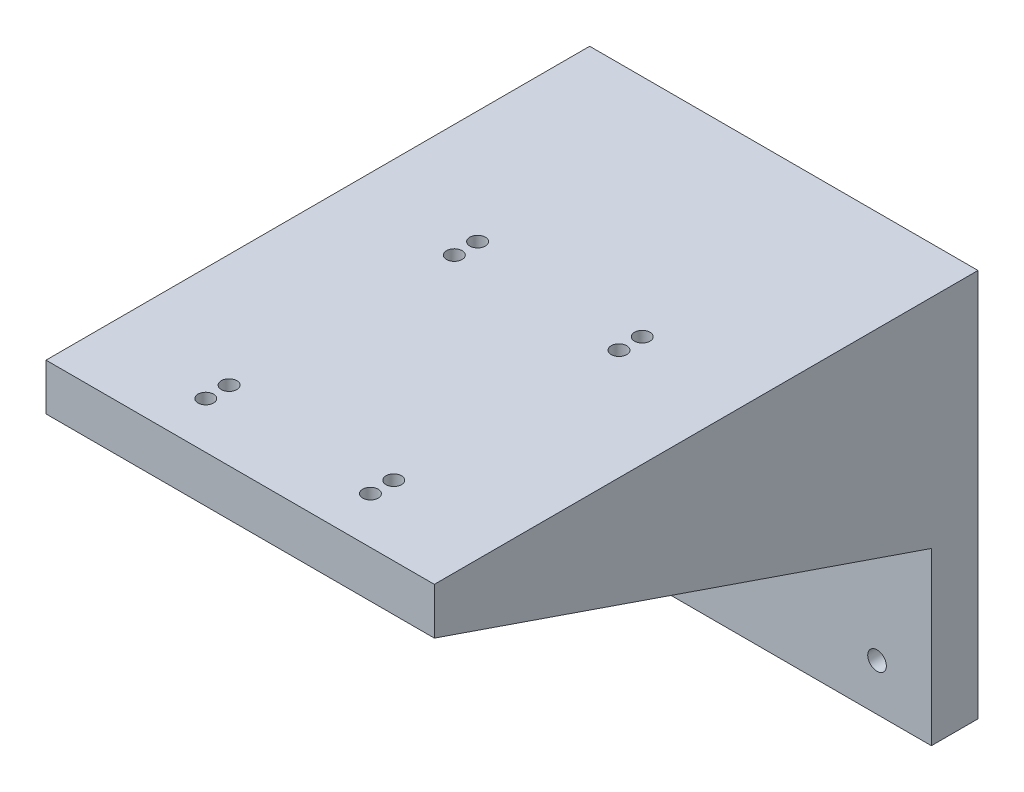
ISO-10303-21;
HEADER;
FILE_DESCRIPTION(('STEP AP214'),'2;1');
FILE_NAME('part.step','',(''),(''),'','','');
FILE_SCHEMA(('AUTOMOTIVE_DESIGN { 1 0 10303 214 1 1 1 1 }'));
ENDSEC;
DATA;
#1=APPLICATION_CONTEXT('core data for automotive mechanical design processes');
#2=APPLICATION_PROTOCOL_DEFINITION('international standard','automotive_design',2000,#1);
#3=PRODUCT_CONTEXT('',#1,'mechanical');
#4=PRODUCT('Part','Part','',(#3));
#5=PRODUCT_RELATED_PRODUCT_CATEGORY('part','',(#4));
#6=PRODUCT_DEFINITION_FORMATION('','',#4);
#7=PRODUCT_DEFINITION_CONTEXT('part definition',#1,'design');
#8=PRODUCT_DEFINITION('design','',#6,#7);
#9=PRODUCT_DEFINITION_SHAPE('','',#8);
#10=(LENGTH_UNIT() NAMED_UNIT(*) SI_UNIT(.MILLI.,.METRE.));
#11=(NAMED_UNIT(*) PLANE_ANGLE_UNIT() SI_UNIT($,.RADIAN.));
#12=(NAMED_UNIT(*) SI_UNIT($,.STERADIAN.) SOLID_ANGLE_UNIT());
#13=UNCERTAINTY_MEASURE_WITH_UNIT(LENGTH_MEASURE(1.E-05),#10,'distance_accuracy_value','');
#14=(GEOMETRIC_REPRESENTATION_CONTEXT(3) GLOBAL_UNCERTAINTY_ASSIGNED_CONTEXT((#13)) GLOBAL_UNIT_ASSIGNED_CONTEXT((#10,
#11,#12)) REPRESENTATION_CONTEXT('',''));
#15=CARTESIAN_POINT('',(0.,0.,0.));
#16=DIRECTION('',(0.,0.,1.));
#17=DIRECTION('',(1.,0.,0.));
#18=AXIS2_PLACEMENT_3D('',#15,#16,#17);
#19=CARTESIAN_POINT('',(-125.,-235.,-145.));
#20=DIRECTION('',(0.,0.,-1.));
#21=DIRECTION('',(-1.,0.,0.));
#22=AXIS2_PLACEMENT_3D('',#19,#20,#21);
#23=PLANE('',#22);
#24=CARTESIAN_POINT('',(-90.,-65.,-145.));
#25=DIRECTION('',(0.,0.,1.));
#26=DIRECTION('',(1.,0.,0.));
#27=AXIS2_PLACEMENT_3D('',#24,#25,#26);
#28=CIRCLE('',#27,6.);
#29=CARTESIAN_POINT('',(-84.,-65.,-145.));
#30=VERTEX_POINT('',#29);
#31=EDGE_CURVE('E402',#30,#30,#28,.T.);
#32=ORIENTED_EDGE('',*,*,#31,.F.);
#33=EDGE_LOOP('',(#32));
#34=FACE_BOUND('',#33,.T.);
#35=CARTESIAN_POINT('',(-90.,-125.,-145.));
#36=DIRECTION('',(0.,0.,1.));
#37=DIRECTION('',(1.,0.,0.));
#38=AXIS2_PLACEMENT_3D('',#35,#36,#37);
#39=CIRCLE('',#38,6.);
#40=CARTESIAN_POINT('',(-84.,-125.,-145.));
#41=VERTEX_POINT('',#40);
#42=EDGE_CURVE('E406',#41,#41,#39,.T.);
#43=ORIENTED_EDGE('',*,*,#42,.F.);
#44=EDGE_LOOP('',(#43));
#45=FACE_BOUND('',#44,.T.);
#46=CARTESIAN_POINT('',(-90.,-205.,-145.));
#47=DIRECTION('',(0.,0.,1.));
#48=DIRECTION('',(1.,0.,0.));
#49=AXIS2_PLACEMENT_3D('',#46,#47,#48);
#50=CIRCLE('',#49,6.);
#51=CARTESIAN_POINT('',(-84.,-205.,-145.));
#52=VERTEX_POINT('',#51);
#53=EDGE_CURVE('E410',#52,#52,#50,.T.);
#54=ORIENTED_EDGE('',*,*,#53,.F.);
#55=EDGE_LOOP('',(#54));
#56=FACE_BOUND('',#55,.T.);
#57=DIRECTION('',(0.,1.,0.));
#58=VECTOR('',#57,1.);
#59=CARTESIAN_POINT('',(125.,-235.,-145.));
#60=LINE('',#59,#58);
#61=CARTESIAN_POINT('',(125.,-235.,-145.));
#62=VERTEX_POINT('',#61);
#63=CARTESIAN_POINT('',(125.,-125.,-145.));
#64=VERTEX_POINT('',#63);
#65=EDGE_CURVE('E87',#62,#64,#60,.T.);
#66=ORIENTED_EDGE('',*,*,#65,.T.);
#67=DIRECTION('',(-1.,0.,0.));
#68=VECTOR('',#67,1.);
#69=CARTESIAN_POINT('',(-125.,-125.,-145.));
#70=LINE('',#69,#68);
#71=CARTESIAN_POINT('',(105.,-125.,-145.));
#72=VERTEX_POINT('',#71);
#73=EDGE_CURVE('E11',#64,#72,#70,.T.);
#74=ORIENTED_EDGE('',*,*,#73,.T.);
#75=DIRECTION('',(0.,-1.,0.));
#76=VECTOR('',#75,1.);
#77=CARTESIAN_POINT('',(105.,-235.,-145.));
#78=LINE('',#77,#76);
#79=CARTESIAN_POINT('',(105.,-15.,-145.));
#80=VERTEX_POINT('',#79);
#81=EDGE_CURVE('E25',#80,#72,#78,.T.);
#82=ORIENTED_EDGE('',*,*,#81,.F.);
#83=DIRECTION('',(-1.,0.,0.));
#84=VECTOR('',#83,1.);
#85=CARTESIAN_POINT('',(-125.,-15.,-145.));
#86=LINE('',#85,#84);
#87=CARTESIAN_POINT('',(-105.,-15.,-145.));
#88=VERTEX_POINT('',#87);
#89=EDGE_CURVE('E119',#80,#88,#86,.T.);
#90=ORIENTED_EDGE('',*,*,#89,.T.);
#91=DIRECTION('',(0.,1.,0.));
#92=VECTOR('',#91,1.);
#93=CARTESIAN_POINT('',(-105.,-235.,-145.));
#94=LINE('',#93,#92);
#95=CARTESIAN_POINT('',(-105.,-125.,-145.));
#96=VERTEX_POINT('',#95);
#97=EDGE_CURVE('E138',#96,#88,#94,.T.);
#98=ORIENTED_EDGE('',*,*,#97,.F.);
#99=DIRECTION('',(-1.,0.,0.));
#100=VECTOR('',#99,1.);
#101=CARTESIAN_POINT('',(-125.,-125.,-145.));
#102=LINE('',#101,#100);
#103=CARTESIAN_POINT('',(-125.,-125.,-145.));
#104=VERTEX_POINT('',#103);
#105=EDGE_CURVE('E96',#96,#104,#102,.T.);
#106=ORIENTED_EDGE('',*,*,#105,.T.);
#107=DIRECTION('',(0.,1.,0.));
#108=VECTOR('',#107,1.);
#109=CARTESIAN_POINT('',(-125.,-235.,-145.));
#110=LINE('',#109,#108);
#111=CARTESIAN_POINT('',(-125.,-235.,-145.));
#112=VERTEX_POINT('',#111);
#113=EDGE_CURVE('E130',#112,#104,#110,.T.);
#114=ORIENTED_EDGE('',*,*,#113,.F.);
#115=DIRECTION('',(-1.,0.,0.));
#116=VECTOR('',#115,1.);
#117=CARTESIAN_POINT('',(-125.,-235.,-145.));
#118=LINE('',#117,#116);
#119=EDGE_CURVE('E128',#62,#112,#118,.T.);
#120=ORIENTED_EDGE('',*,*,#119,.F.);
#121=EDGE_LOOP('',(#66,#74,#82,#90,#98,#106,#114,#120));
#122=FACE_BOUND('',#121,.T.);
#123=CARTESIAN_POINT('',(90.,-205.,-145.));
#124=DIRECTION('',(0.,0.,1.));
#125=DIRECTION('',(1.,0.,0.));
#126=AXIS2_PLACEMENT_3D('',#123,#124,#125);
#127=CIRCLE('',#126,6.);
#128=CARTESIAN_POINT('',(96.,-205.,-145.));
#129=VERTEX_POINT('',#128);
#130=EDGE_CURVE('E246',#129,#129,#127,.T.);
#131=ORIENTED_EDGE('',*,*,#130,.F.);
#132=EDGE_LOOP('',(#131));
#133=FACE_BOUND('',#132,.T.);
#134=CARTESIAN_POINT('',(90.,-125.,-145.));
#135=DIRECTION('',(0.,0.,1.));
#136=DIRECTION('',(1.,0.,0.));
#137=AXIS2_PLACEMENT_3D('',#134,#135,#136);
#138=CIRCLE('',#137,6.);
#139=CARTESIAN_POINT('',(96.,-125.,-145.));
#140=VERTEX_POINT('',#139);
#141=EDGE_CURVE('E418',#140,#140,#138,.T.);
#142=ORIENTED_EDGE('',*,*,#141,.F.);
#143=EDGE_LOOP('',(#142));
#144=FACE_BOUND('',#143,.T.);
#145=CARTESIAN_POINT('',(90.,-65.,-145.));
#146=DIRECTION('',(0.,0.,1.));
#147=DIRECTION('',(1.,0.,0.));
#148=AXIS2_PLACEMENT_3D('',#145,#146,#147);
#149=CIRCLE('',#148,6.);
#150=CARTESIAN_POINT('',(96.,-65.,-145.));
#151=VERTEX_POINT('',#150);
#152=EDGE_CURVE('E414',#151,#151,#149,.T.);
#153=ORIENTED_EDGE('',*,*,#152,.F.);
#154=EDGE_LOOP('',(#153));
#155=FACE_BOUND('',#154,.T.);
#156=ADVANCED_FACE('F17',(#34,#45,#56,#122,#133,#144,#155),#23,.F.);
#157=CARTESIAN_POINT('',(0.,-15.,0.));
#158=DIRECTION('',(0.,-1.,0.));
#159=DIRECTION('',(0.,0.,-1.));
#160=AXIS2_PLACEMENT_3D('',#157,#158,#159);
#161=PLANE('',#160);
#162=CARTESIAN_POINT('',(53.8620612660135,-15.,145.));
#163=DIRECTION('',(0.,-1.,0.));
#164=DIRECTION('',(0.,0.,-1.));
#165=AXIS2_PLACEMENT_3D('',#162,#163,#164);
#166=CIRCLE('',#165,5.);
#167=CARTESIAN_POINT('',(53.8620612660135,-15.,140.));
#168=VERTEX_POINT('',#167);
#169=EDGE_CURVE('E386',#168,#168,#166,.T.);
#170=ORIENTED_EDGE('',*,*,#169,.F.);
#171=EDGE_LOOP('',(#170));
#172=FACE_BOUND('',#171,.T.);
#173=CARTESIAN_POINT('',(53.8620612660135,-15.,-15.));
#174=DIRECTION('',(0.,-1.,0.));
#175=DIRECTION('',(0.,0.,-1.));
#176=AXIS2_PLACEMENT_3D('',#173,#174,#175);
#177=CIRCLE('',#176,5.);
#178=CARTESIAN_POINT('',(53.8620612660135,-15.,-20.));
#179=VERTEX_POINT('',#178);
#180=EDGE_CURVE('E388',#179,#179,#177,.T.);
#181=ORIENTED_EDGE('',*,*,#180,.F.);
#182=EDGE_LOOP('',(#181));
#183=FACE_BOUND('',#182,.T.);
#184=CARTESIAN_POINT('',(-52.1379387339865,-15.,-15.));
#185=DIRECTION('',(0.,-1.,0.));
#186=DIRECTION('',(0.,0.,-1.));
#187=AXIS2_PLACEMENT_3D('',#184,#185,#186);
#188=CIRCLE('',#187,5.);
#189=CARTESIAN_POINT('',(-52.1379387339865,-15.,-20.));
#190=VERTEX_POINT('',#189);
#191=EDGE_CURVE('E395',#190,#190,#188,.T.);
#192=ORIENTED_EDGE('',*,*,#191,.F.);
#193=EDGE_LOOP('',(#192));
#194=FACE_BOUND('',#193,.T.);
#195=CARTESIAN_POINT('',(-52.1379387339865,-15.,145.));
#196=DIRECTION('',(0.,-1.,0.));
#197=DIRECTION('',(0.,0.,-1.));
#198=AXIS2_PLACEMENT_3D('',#195,#196,#197);
#199=CIRCLE('',#198,5.);
#200=CARTESIAN_POINT('',(-52.1379387339865,-15.,140.));
#201=VERTEX_POINT('',#200);
#202=EDGE_CURVE('E399',#201,#201,#199,.T.);
#203=ORIENTED_EDGE('',*,*,#202,.F.);
#204=EDGE_LOOP('',(#203));
#205=FACE_BOUND('',#204,.T.);
#206=CARTESIAN_POINT('',(-52.1379387339865,-15.,130.));
#207=DIRECTION('',(0.,-1.,0.));
#208=DIRECTION('',(0.,0.,-1.));
#209=AXIS2_PLACEMENT_3D('',#206,#207,#208);
#210=CIRCLE('',#209,5.);
#211=CARTESIAN_POINT('',(-52.1379387339865,-15.,125.));
#212=VERTEX_POINT('',#211);
#213=EDGE_CURVE('E245',#212,#212,#210,.T.);
#214=ORIENTED_EDGE('',*,*,#213,.F.);
#215=EDGE_LOOP('',(#214));
#216=FACE_BOUND('',#215,.T.);
#217=CARTESIAN_POINT('',(53.8620612660135,-15.,130.));
#218=DIRECTION('',(0.,-1.,0.));
#219=DIRECTION('',(0.,0.,-1.));
#220=AXIS2_PLACEMENT_3D('',#217,#218,#219);
#221=CIRCLE('',#220,5.);
#222=CARTESIAN_POINT('',(53.8620612660135,-15.,125.));
#223=VERTEX_POINT('',#222);
#224=EDGE_CURVE('E257',#223,#223,#221,.T.);
#225=ORIENTED_EDGE('',*,*,#224,.F.);
#226=EDGE_LOOP('',(#225));
#227=FACE_BOUND('',#226,.T.);
#228=CARTESIAN_POINT('',(53.8620612660135,-15.,-30.));
#229=DIRECTION('',(0.,-1.,0.));
#230=DIRECTION('',(0.,0.,-1.));
#231=AXIS2_PLACEMENT_3D('',#228,#229,#230);
#232=CIRCLE('',#231,5.);
#233=CARTESIAN_POINT('',(53.8620612660135,-15.,-35.));
#234=VERTEX_POINT('',#233);
#235=EDGE_CURVE('E263',#234,#234,#232,.T.);
#236=ORIENTED_EDGE('',*,*,#235,.F.);
#237=EDGE_LOOP('',(#236));
#238=FACE_BOUND('',#237,.T.);
#239=CARTESIAN_POINT('',(-52.1379387339865,-15.,-30.));
#240=DIRECTION('',(0.,-1.,0.));
#241=DIRECTION('',(0.,0.,-1.));
#242=AXIS2_PLACEMENT_3D('',#239,#240,#241);
#243=CIRCLE('',#242,5.);
#244=CARTESIAN_POINT('',(-52.1379387339865,-15.,-35.));
#245=VERTEX_POINT('',#244);
#246=EDGE_CURVE('E105',#245,#245,#243,.T.);
#247=ORIENTED_EDGE('',*,*,#246,.F.);
#248=EDGE_LOOP('',(#247));
#249=FACE_BOUND('',#248,.T.);
#250=ORIENTED_EDGE('',*,*,#89,.F.);
#251=DIRECTION('',(0.,0.,1.));
#252=VECTOR('',#251,1.);
#253=CARTESIAN_POINT('',(105.,-15.,0.));
#254=LINE('',#253,#252);
#255=CARTESIAN_POINT('',(105.,-15.,175.));
#256=VERTEX_POINT('',#255);
#257=EDGE_CURVE('E32',#80,#256,#254,.T.);
#258=ORIENTED_EDGE('',*,*,#257,.T.);
#259=DIRECTION('',(1.,0.,0.));
#260=VECTOR('',#259,1.);
#261=CARTESIAN_POINT('',(-125.,-15.,175.));
#262=LINE('',#261,#260);
#263=CARTESIAN_POINT('',(-105.,-15.,175.));
#264=VERTEX_POINT('',#263);
#265=EDGE_CURVE('E145',#264,#256,#262,.T.);
#266=ORIENTED_EDGE('',*,*,#265,.F.);
#267=DIRECTION('',(0.,0.,-1.));
#268=VECTOR('',#267,1.);
#269=CARTESIAN_POINT('',(-105.,-15.,0.));
#270=LINE('',#269,#268);
#271=EDGE_CURVE('E114',#264,#88,#270,.T.);
#272=ORIENTED_EDGE('',*,*,#271,.T.);
#273=EDGE_LOOP('',(#250,#258,#266,#272));
#274=FACE_BOUND('',#273,.T.);
#275=ADVANCED_FACE('F197',(#172,#183,#194,#205,#216,#227,#238,#249,#274),#161,.T.);
#276=CARTESIAN_POINT('',(125.,15.,175.));
#277=DIRECTION('',(-1.,0.,0.));
#278=DIRECTION('',(0.,0.,1.));
#279=AXIS2_PLACEMENT_3D('',#276,#277,#278);
#280=PLANE('',#279);
#281=DIRECTION('',(0.,-1.,0.));
#282=VECTOR('',#281,1.);
#283=CARTESIAN_POINT('',(125.,15.,175.));
#284=LINE('',#283,#282);
#285=CARTESIAN_POINT('',(125.,15.,175.));
#286=VERTEX_POINT('',#285);
#287=CARTESIAN_POINT('',(125.,-15.,175.));
#288=VERTEX_POINT('',#287);
#289=EDGE_CURVE('E155',#286,#288,#284,.T.);
#290=ORIENTED_EDGE('',*,*,#289,.T.);
#291=DIRECTION('',(0.,-0.325079768511048,-0.945686599304867));
#292=VECTOR('',#291,1.);
#293=CARTESIAN_POINT('',(125.,-15.,175.));
#294=LINE('',#293,#292);
#295=EDGE_CURVE('E100',#288,#64,#294,.T.);
#296=ORIENTED_EDGE('',*,*,#295,.T.);
#297=ORIENTED_EDGE('',*,*,#65,.F.);
#298=DIRECTION('',(0.,0.,1.));
#299=VECTOR('',#298,1.);
#300=CARTESIAN_POINT('',(125.,-235.,-175.));
#301=LINE('',#300,#299);
#302=CARTESIAN_POINT('',(125.,-235.,-175.));
#303=VERTEX_POINT('',#302);
#304=EDGE_CURVE('E126',#303,#62,#301,.T.);
#305=ORIENTED_EDGE('',*,*,#304,.F.);
#306=DIRECTION('',(0.,-1.,0.));
#307=VECTOR('',#306,1.);
#308=CARTESIAN_POINT('',(125.,15.,-175.));
#309=LINE('',#308,#307);
#310=CARTESIAN_POINT('',(125.,15.,-175.));
#311=VERTEX_POINT('',#310);
#312=EDGE_CURVE('E141',#311,#303,#309,.T.);
#313=ORIENTED_EDGE('',*,*,#312,.F.);
#314=DIRECTION('',(0.,0.,-1.));
#315=VECTOR('',#314,1.);
#316=CARTESIAN_POINT('',(125.,15.,175.));
#317=LINE('',#316,#315);
#318=EDGE_CURVE('E133',#286,#311,#317,.T.);
#319=ORIENTED_EDGE('',*,*,#318,.F.);
#320=EDGE_LOOP('',(#290,#296,#297,#305,#313,#319));
#321=FACE_BOUND('',#320,.T.);
#322=ADVANCED_FACE('F19',(#321),#280,.F.);
#323=CARTESIAN_POINT('',(-125.,15.,-175.));
#324=DIRECTION('',(0.,0.,1.));
#325=DIRECTION('',(1.,0.,0.));
#326=AXIS2_PLACEMENT_3D('',#323,#324,#325);
#327=PLANE('',#326);
#328=CARTESIAN_POINT('',(-90.,-65.,-175.));
#329=DIRECTION('',(0.,0.,1.));
#330=DIRECTION('',(1.,0.,0.));
#331=AXIS2_PLACEMENT_3D('',#328,#329,#330);
#332=CIRCLE('',#331,6.);
#333=CARTESIAN_POINT('',(-84.,-65.,-175.));
#334=VERTEX_POINT('',#333);
#335=EDGE_CURVE('E224',#334,#334,#332,.T.);
#336=ORIENTED_EDGE('',*,*,#335,.T.);
#337=EDGE_LOOP('',(#336));
#338=FACE_BOUND('',#337,.T.);
#339=CARTESIAN_POINT('',(-90.,-125.,-175.));
#340=DIRECTION('',(0.,0.,1.));
#341=DIRECTION('',(1.,0.,0.));
#342=AXIS2_PLACEMENT_3D('',#339,#340,#341);
#343=CIRCLE('',#342,6.);
#344=CARTESIAN_POINT('',(-84.,-125.,-175.));
#345=VERTEX_POINT('',#344);
#346=EDGE_CURVE('E228',#345,#345,#343,.T.);
#347=ORIENTED_EDGE('',*,*,#346,.T.);
#348=EDGE_LOOP('',(#347));
#349=FACE_BOUND('',#348,.T.);
#350=CARTESIAN_POINT('',(-90.,-205.,-175.));
#351=DIRECTION('',(0.,0.,1.));
#352=DIRECTION('',(1.,0.,0.));
#353=AXIS2_PLACEMENT_3D('',#350,#351,#352);
#354=CIRCLE('',#353,6.);
#355=CARTESIAN_POINT('',(-84.,-205.,-175.));
#356=VERTEX_POINT('',#355);
#357=EDGE_CURVE('E232',#356,#356,#354,.T.);
#358=ORIENTED_EDGE('',*,*,#357,.T.);
#359=EDGE_LOOP('',(#358));
#360=FACE_BOUND('',#359,.T.);
#361=CARTESIAN_POINT('',(90.,-65.,-175.));
#362=DIRECTION('',(0.,0.,1.));
#363=DIRECTION('',(1.,0.,0.));
#364=AXIS2_PLACEMENT_3D('',#361,#362,#363);
#365=CIRCLE('',#364,6.);
#366=CARTESIAN_POINT('',(96.,-65.,-175.));
#367=VERTEX_POINT('',#366);
#368=EDGE_CURVE('E236',#367,#367,#365,.T.);
#369=ORIENTED_EDGE('',*,*,#368,.T.);
#370=EDGE_LOOP('',(#369));
#371=FACE_BOUND('',#370,.T.);
#372=CARTESIAN_POINT('',(90.,-125.,-175.));
#373=DIRECTION('',(0.,0.,1.));
#374=DIRECTION('',(1.,0.,0.));
#375=AXIS2_PLACEMENT_3D('',#372,#373,#374);
#376=CIRCLE('',#375,6.);
#377=CARTESIAN_POINT('',(96.,-125.,-175.));
#378=VERTEX_POINT('',#377);
#379=EDGE_CURVE('E240',#378,#378,#376,.T.);
#380=ORIENTED_EDGE('',*,*,#379,.T.);
#381=EDGE_LOOP('',(#380));
#382=FACE_BOUND('',#381,.T.);
#383=CARTESIAN_POINT('',(90.,-205.,-175.));
#384=DIRECTION('',(0.,0.,1.));
#385=DIRECTION('',(1.,0.,0.));
#386=AXIS2_PLACEMENT_3D('',#383,#384,#385);
#387=CIRCLE('',#386,6.);
#388=CARTESIAN_POINT('',(96.,-205.,-175.));
#389=VERTEX_POINT('',#388);
#390=EDGE_CURVE('E243',#389,#389,#387,.T.);
#391=ORIENTED_EDGE('',*,*,#390,.T.);
#392=EDGE_LOOP('',(#391));
#393=FACE_BOUND('',#392,.T.);
#394=ORIENTED_EDGE('',*,*,#312,.T.);
#395=DIRECTION('',(1.,0.,0.));
#396=VECTOR('',#395,1.);
#397=CARTESIAN_POINT('',(-125.,-235.,-175.));
#398=LINE('',#397,#396);
#399=CARTESIAN_POINT('',(-125.,-235.,-175.));
#400=VERTEX_POINT('',#399);
#401=EDGE_CURVE('E123',#400,#303,#398,.T.);
#402=ORIENTED_EDGE('',*,*,#401,.F.);
#403=DIRECTION('',(0.,-1.,0.));
#404=VECTOR('',#403,1.);
#405=CARTESIAN_POINT('',(-125.,15.,-175.));
#406=LINE('',#405,#404);
#407=CARTESIAN_POINT('',(-125.,15.,-175.));
#408=VERTEX_POINT('',#407);
#409=EDGE_CURVE('E151',#408,#400,#406,.T.);
#410=ORIENTED_EDGE('',*,*,#409,.F.);
#411=DIRECTION('',(-1.,0.,0.));
#412=VECTOR('',#411,1.);
#413=CARTESIAN_POINT('',(-125.,15.,-175.));
#414=LINE('',#413,#412);
#415=EDGE_CURVE('E164',#311,#408,#414,.T.);
#416=ORIENTED_EDGE('',*,*,#415,.F.);
#417=EDGE_LOOP('',(#394,#402,#410,#416));
#418=FACE_BOUND('',#417,.T.);
#419=ADVANCED_FACE('F177',(#338,#349,#360,#371,#382,#393,#418),#327,.F.);
#420=CARTESIAN_POINT('',(-125.,15.,175.));
#421=DIRECTION('',(1.,0.,0.));
#422=DIRECTION('',(0.,0.,-1.));
#423=AXIS2_PLACEMENT_3D('',#420,#421,#422);
#424=PLANE('',#423);
#425=DIRECTION('',(0.,0.325079768511048,0.945686599304867));
#426=VECTOR('',#425,1.);
#427=CARTESIAN_POINT('',(-125.,-125.,-145.));
#428=LINE('',#427,#426);
#429=CARTESIAN_POINT('',(-125.,-15.,175.));
#430=VERTEX_POINT('',#429);
#431=EDGE_CURVE('E111',#104,#430,#428,.T.);
#432=ORIENTED_EDGE('',*,*,#431,.T.);
#433=DIRECTION('',(0.,-1.,0.));
#434=VECTOR('',#433,1.);
#435=CARTESIAN_POINT('',(-125.,15.,175.));
#436=LINE('',#435,#434);
#437=CARTESIAN_POINT('',(-125.,15.,175.));
#438=VERTEX_POINT('',#437);
#439=EDGE_CURVE('E153',#438,#430,#436,.T.);
#440=ORIENTED_EDGE('',*,*,#439,.F.);
#441=DIRECTION('',(0.,0.,1.));
#442=VECTOR('',#441,1.);
#443=CARTESIAN_POINT('',(-125.,15.,175.));
#444=LINE('',#443,#442);
#445=EDGE_CURVE('E163',#408,#438,#444,.T.);
#446=ORIENTED_EDGE('',*,*,#445,.F.);
#447=ORIENTED_EDGE('',*,*,#409,.T.);
#448=DIRECTION('',(0.,0.,-1.));
#449=VECTOR('',#448,1.);
#450=CARTESIAN_POINT('',(-125.,-235.,-175.));
#451=LINE('',#450,#449);
#452=EDGE_CURVE('E120',#112,#400,#451,.T.);
#453=ORIENTED_EDGE('',*,*,#452,.F.);
#454=ORIENTED_EDGE('',*,*,#113,.T.);
#455=EDGE_LOOP('',(#432,#440,#446,#447,#453,#454));
#456=FACE_BOUND('',#455,.T.);
#457=ADVANCED_FACE('F183',(#456),#424,.F.);
#458=CARTESIAN_POINT('',(-125.,15.,175.));
#459=DIRECTION('',(0.,0.,-1.));
#460=DIRECTION('',(-1.,0.,0.));
#461=AXIS2_PLACEMENT_3D('',#458,#459,#460);
#462=PLANE('',#461);
#463=ORIENTED_EDGE('',*,*,#289,.F.);
#464=DIRECTION('',(1.,0.,0.));
#465=VECTOR('',#464,1.);
#466=CARTESIAN_POINT('',(-125.,15.,175.));
#467=LINE('',#466,#465);
#468=EDGE_CURVE('E158',#438,#286,#467,.T.);
#469=ORIENTED_EDGE('',*,*,#468,.F.);
#470=ORIENTED_EDGE('',*,*,#439,.T.);
#471=EDGE_CURVE('E159',#430,#264,#262,.T.);
#472=ORIENTED_EDGE('',*,*,#471,.T.);
#473=ORIENTED_EDGE('',*,*,#265,.T.);
#474=DIRECTION('',(-1.,0.,0.));
#475=VECTOR('',#474,1.);
#476=CARTESIAN_POINT('',(-125.,-15.,175.));
#477=LINE('',#476,#475);
#478=EDGE_CURVE('E99',#288,#256,#477,.T.);
#479=ORIENTED_EDGE('',*,*,#478,.F.);
#480=EDGE_LOOP('',(#463,#469,#470,#472,#473,#479));
#481=FACE_BOUND('',#480,.T.);
#482=ADVANCED_FACE('F189',(#481),#462,.F.);
#483=CARTESIAN_POINT('',(0.,15.,0.));
#484=DIRECTION('',(0.,-1.,0.));
#485=DIRECTION('',(0.,0.,-1.));
#486=AXIS2_PLACEMENT_3D('',#483,#484,#485);
#487=PLANE('',#486);
#488=CARTESIAN_POINT('',(53.8620612660135,15.,145.));
#489=DIRECTION('',(0.,-1.,0.));
#490=DIRECTION('',(0.,0.,-1.));
#491=AXIS2_PLACEMENT_3D('',#488,#489,#490);
#492=CIRCLE('',#491,5.);
#493=CARTESIAN_POINT('',(53.8620612660135,15.,140.));
#494=VERTEX_POINT('',#493);
#495=EDGE_CURVE('E308',#494,#494,#492,.T.);
#496=ORIENTED_EDGE('',*,*,#495,.T.);
#497=EDGE_LOOP('',(#496));
#498=FACE_BOUND('',#497,.T.);
#499=CARTESIAN_POINT('',(53.8620612660135,15.,-15.));
#500=DIRECTION('',(0.,-1.,0.));
#501=DIRECTION('',(0.,0.,-1.));
#502=AXIS2_PLACEMENT_3D('',#499,#500,#501);
#503=CIRCLE('',#502,5.);
#504=CARTESIAN_POINT('',(53.8620612660135,15.,-20.));
#505=VERTEX_POINT('',#504);
#506=EDGE_CURVE('E312',#505,#505,#503,.T.);
#507=ORIENTED_EDGE('',*,*,#506,.T.);
#508=EDGE_LOOP('',(#507));
#509=FACE_BOUND('',#508,.T.);
#510=CARTESIAN_POINT('',(-52.1379387339865,15.,-15.));
#511=DIRECTION('',(0.,-1.,0.));
#512=DIRECTION('',(0.,0.,-1.));
#513=AXIS2_PLACEMENT_3D('',#510,#511,#512);
#514=CIRCLE('',#513,5.);
#515=CARTESIAN_POINT('',(-52.1379387339865,15.,-20.));
#516=VERTEX_POINT('',#515);
#517=EDGE_CURVE('E316',#516,#516,#514,.T.);
#518=ORIENTED_EDGE('',*,*,#517,.T.);
#519=EDGE_LOOP('',(#518));
#520=FACE_BOUND('',#519,.T.);
#521=CARTESIAN_POINT('',(-52.1379387339865,15.,145.));
#522=DIRECTION('',(0.,-1.,0.));
#523=DIRECTION('',(0.,0.,-1.));
#524=AXIS2_PLACEMENT_3D('',#521,#522,#523);
#525=CIRCLE('',#524,5.);
#526=CARTESIAN_POINT('',(-52.1379387339865,15.,140.));
#527=VERTEX_POINT('',#526);
#528=EDGE_CURVE('E320',#527,#527,#525,.T.);
#529=ORIENTED_EDGE('',*,*,#528,.T.);
#530=EDGE_LOOP('',(#529));
#531=FACE_BOUND('',#530,.T.);
#532=CARTESIAN_POINT('',(-52.1379387339865,15.,130.));
#533=DIRECTION('',(0.,-1.,0.));
#534=DIRECTION('',(0.,0.,-1.));
#535=AXIS2_PLACEMENT_3D('',#532,#533,#534);
#536=CIRCLE('',#535,5.);
#537=CARTESIAN_POINT('',(-52.1379387339865,15.,125.));
#538=VERTEX_POINT('',#537);
#539=EDGE_CURVE('E249',#538,#538,#536,.T.);
#540=ORIENTED_EDGE('',*,*,#539,.T.);
#541=EDGE_LOOP('',(#540));
#542=FACE_BOUND('',#541,.T.);
#543=CARTESIAN_POINT('',(53.8620612660135,15.,130.));
#544=DIRECTION('',(0.,-1.,0.));
#545=DIRECTION('',(0.,0.,-1.));
#546=AXIS2_PLACEMENT_3D('',#543,#544,#545);
#547=CIRCLE('',#546,5.);
#548=CARTESIAN_POINT('',(53.8620612660135,15.,125.));
#549=VERTEX_POINT('',#548);
#550=EDGE_CURVE('E260',#549,#549,#547,.T.);
#551=ORIENTED_EDGE('',*,*,#550,.T.);
#552=EDGE_LOOP('',(#551));
#553=FACE_BOUND('',#552,.T.);
#554=CARTESIAN_POINT('',(53.8620612660135,15.,-30.));
#555=DIRECTION('',(0.,-1.,0.));
#556=DIRECTION('',(0.,0.,-1.));
#557=AXIS2_PLACEMENT_3D('',#554,#555,#556);
#558=CIRCLE('',#557,5.);
#559=CARTESIAN_POINT('',(53.8620612660135,15.,-35.));
#560=VERTEX_POINT('',#559);
#561=EDGE_CURVE('E266',#560,#560,#558,.T.);
#562=ORIENTED_EDGE('',*,*,#561,.T.);
#563=EDGE_LOOP('',(#562));
#564=FACE_BOUND('',#563,.T.);
#565=CARTESIAN_POINT('',(-52.1379387339865,15.,-30.));
#566=DIRECTION('',(0.,-1.,0.));
#567=DIRECTION('',(0.,0.,-1.));
#568=AXIS2_PLACEMENT_3D('',#565,#566,#567);
#569=CIRCLE('',#568,5.);
#570=CARTESIAN_POINT('',(-52.1379387339865,15.,-35.));
#571=VERTEX_POINT('',#570);
#572=EDGE_CURVE('E101',#571,#571,#569,.T.);
#573=ORIENTED_EDGE('',*,*,#572,.T.);
#574=EDGE_LOOP('',(#573));
#575=FACE_BOUND('',#574,.T.);
#576=ORIENTED_EDGE('',*,*,#415,.T.);
#577=ORIENTED_EDGE('',*,*,#445,.T.);
#578=ORIENTED_EDGE('',*,*,#468,.T.);
#579=ORIENTED_EDGE('',*,*,#318,.T.);
#580=EDGE_LOOP('',(#576,#577,#578,#579));
#581=FACE_BOUND('',#580,.T.);
#582=ADVANCED_FACE('F170',(#498,#509,#520,#531,#542,#553,#564,#575,#581),#487,.F.);
#583=CARTESIAN_POINT('',(0.,-235.,0.));
#584=DIRECTION('',(0.,1.,0.));
#585=DIRECTION('',(0.,0.,1.));
#586=AXIS2_PLACEMENT_3D('',#583,#584,#585);
#587=PLANE('',#586);
#588=ORIENTED_EDGE('',*,*,#452,.T.);
#589=ORIENTED_EDGE('',*,*,#401,.T.);
#590=ORIENTED_EDGE('',*,*,#304,.T.);
#591=ORIENTED_EDGE('',*,*,#119,.T.);
#592=EDGE_LOOP('',(#588,#589,#590,#591));
#593=FACE_BOUND('',#592,.T.);
#594=ADVANCED_FACE('F179',(#593),#587,.F.);
#595=CARTESIAN_POINT('',(-125.,-125.,-145.));
#596=DIRECTION('',(0.,-0.945686599304867,0.325079768511048));
#597=DIRECTION('',(0.,0.325079768511048,0.945686599304867));
#598=AXIS2_PLACEMENT_3D('',#595,#596,#597);
#599=PLANE('',#598);
#600=DIRECTION('',(0.,0.325079768511048,0.945686599304867));
#601=VECTOR('',#600,1.);
#602=CARTESIAN_POINT('',(-105.,-125.,-145.));
#603=LINE('',#602,#601);
#604=EDGE_CURVE('E110',#96,#264,#603,.T.);
#605=ORIENTED_EDGE('',*,*,#604,.T.);
#606=ORIENTED_EDGE('',*,*,#471,.F.);
#607=ORIENTED_EDGE('',*,*,#431,.F.);
#608=ORIENTED_EDGE('',*,*,#105,.F.);
#609=EDGE_LOOP('',(#605,#606,#607,#608));
#610=FACE_BOUND('',#609,.T.);
#611=ADVANCED_FACE('F193',(#610),#599,.T.);
#612=CARTESIAN_POINT('',(-105.,-110.0000125,1.24999999934205E-05));
#613=DIRECTION('',(-1.,0.,0.));
#614=DIRECTION('',(0.,0.,1.));
#615=AXIS2_PLACEMENT_3D('',#612,#613,#614);
#616=PLANE('',#615);
#617=ORIENTED_EDGE('',*,*,#271,.F.);
#618=ORIENTED_EDGE('',*,*,#604,.F.);
#619=ORIENTED_EDGE('',*,*,#97,.T.);
#620=EDGE_LOOP('',(#617,#618,#619));
#621=FACE_BOUND('',#620,.T.);
#622=ADVANCED_FACE('F196',(#621),#616,.F.);
#623=CARTESIAN_POINT('',(125.,-15.,175.));
#624=DIRECTION('',(0.,-0.945686599304867,0.325079768511048));
#625=DIRECTION('',(0.,-0.325079768511048,-0.945686599304867));
#626=AXIS2_PLACEMENT_3D('',#623,#624,#625);
#627=PLANE('',#626);
#628=ORIENTED_EDGE('',*,*,#295,.F.);
#629=ORIENTED_EDGE('',*,*,#478,.T.);
#630=DIRECTION('',(0.,-0.325079768511048,-0.945686599304867));
#631=VECTOR('',#630,1.);
#632=CARTESIAN_POINT('',(105.,-15.,175.));
#633=LINE('',#632,#631);
#634=EDGE_CURVE('E95',#256,#72,#633,.T.);
#635=ORIENTED_EDGE('',*,*,#634,.T.);
#636=ORIENTED_EDGE('',*,*,#73,.F.);
#637=EDGE_LOOP('',(#628,#629,#635,#636));
#638=FACE_BOUND('',#637,.T.);
#639=ADVANCED_FACE('F98',(#638),#627,.T.);
#640=CARTESIAN_POINT('',(105.,-110.0000125,1.24999999934205E-05));
#641=DIRECTION('',(1.,0.,0.));
#642=DIRECTION('',(0.,0.,-1.));
#643=AXIS2_PLACEMENT_3D('',#640,#641,#642);
#644=PLANE('',#643);
#645=ORIENTED_EDGE('',*,*,#257,.F.);
#646=ORIENTED_EDGE('',*,*,#81,.T.);
#647=ORIENTED_EDGE('',*,*,#634,.F.);
#648=EDGE_LOOP('',(#645,#646,#647));
#649=FACE_BOUND('',#648,.T.);
#650=ADVANCED_FACE('F94',(#649),#644,.F.);
#651=CARTESIAN_POINT('',(-52.1379387339865,-15.,-30.));
#652=DIRECTION('',(0.,-1.,0.));
#653=DIRECTION('',(0.,0.,-1.));
#654=AXIS2_PLACEMENT_3D('',#651,#652,#653);
#655=CYLINDRICAL_SURFACE('',#654,5.);
#656=ORIENTED_EDGE('',*,*,#572,.F.);
#657=EDGE_LOOP('',(#656));
#658=FACE_BOUND('',#657,.T.);
#659=ORIENTED_EDGE('',*,*,#246,.T.);
#660=EDGE_LOOP('',(#659));
#661=FACE_BOUND('',#660,.T.);
#662=ADVANCED_FACE('F272',(#658,#661),#655,.F.);
#663=CARTESIAN_POINT('',(53.8620612660135,-15.,-30.));
#664=DIRECTION('',(0.,-1.,0.));
#665=DIRECTION('',(0.,0.,-1.));
#666=AXIS2_PLACEMENT_3D('',#663,#664,#665);
#667=CYLINDRICAL_SURFACE('',#666,5.);
#668=ORIENTED_EDGE('',*,*,#561,.F.);
#669=EDGE_LOOP('',(#668));
#670=FACE_BOUND('',#669,.T.);
#671=ORIENTED_EDGE('',*,*,#235,.T.);
#672=EDGE_LOOP('',(#671));
#673=FACE_BOUND('',#672,.T.);
#674=ADVANCED_FACE('F275',(#670,#673),#667,.F.);
#675=CARTESIAN_POINT('',(53.8620612660135,-15.,130.));
#676=DIRECTION('',(0.,-1.,0.));
#677=DIRECTION('',(0.,0.,-1.));
#678=AXIS2_PLACEMENT_3D('',#675,#676,#677);
#679=CYLINDRICAL_SURFACE('',#678,5.);
#680=ORIENTED_EDGE('',*,*,#550,.F.);
#681=EDGE_LOOP('',(#680));
#682=FACE_BOUND('',#681,.T.);
#683=ORIENTED_EDGE('',*,*,#224,.T.);
#684=EDGE_LOOP('',(#683));
#685=FACE_BOUND('',#684,.T.);
#686=ADVANCED_FACE('F283',(#682,#685),#679,.F.);
#687=CARTESIAN_POINT('',(-52.1379387339865,-15.,130.));
#688=DIRECTION('',(0.,-1.,0.));
#689=DIRECTION('',(0.,0.,-1.));
#690=AXIS2_PLACEMENT_3D('',#687,#688,#689);
#691=CYLINDRICAL_SURFACE('',#690,5.);
#692=ORIENTED_EDGE('',*,*,#539,.F.);
#693=EDGE_LOOP('',(#692));
#694=FACE_BOUND('',#693,.T.);
#695=ORIENTED_EDGE('',*,*,#213,.T.);
#696=EDGE_LOOP('',(#695));
#697=FACE_BOUND('',#696,.T.);
#698=ADVANCED_FACE('F333',(#694,#697),#691,.F.);
#699=CARTESIAN_POINT('',(90.,-205.,-145.));
#700=DIRECTION('',(0.,0.,1.));
#701=DIRECTION('',(1.,0.,0.));
#702=AXIS2_PLACEMENT_3D('',#699,#700,#701);
#703=CYLINDRICAL_SURFACE('',#702,6.);
#704=ORIENTED_EDGE('',*,*,#390,.F.);
#705=EDGE_LOOP('',(#704));
#706=FACE_BOUND('',#705,.T.);
#707=ORIENTED_EDGE('',*,*,#130,.T.);
#708=EDGE_LOOP('',(#707));
#709=FACE_BOUND('',#708,.T.);
#710=ADVANCED_FACE('F340',(#706,#709),#703,.F.);
#711=CARTESIAN_POINT('',(90.,-125.,-145.));
#712=DIRECTION('',(0.,0.,1.));
#713=DIRECTION('',(1.,0.,0.));
#714=AXIS2_PLACEMENT_3D('',#711,#712,#713);
#715=CYLINDRICAL_SURFACE('',#714,6.);
#716=ORIENTED_EDGE('',*,*,#379,.F.);
#717=EDGE_LOOP('',(#716));
#718=FACE_BOUND('',#717,.T.);
#719=ORIENTED_EDGE('',*,*,#141,.T.);
#720=EDGE_LOOP('',(#719));
#721=FACE_BOUND('',#720,.T.);
#722=ADVANCED_FACE('F346',(#718,#721),#715,.F.);
#723=CARTESIAN_POINT('',(90.,-65.,-145.));
#724=DIRECTION('',(0.,0.,1.));
#725=DIRECTION('',(1.,0.,0.));
#726=AXIS2_PLACEMENT_3D('',#723,#724,#725);
#727=CYLINDRICAL_SURFACE('',#726,6.);
#728=ORIENTED_EDGE('',*,*,#368,.F.);
#729=EDGE_LOOP('',(#728));
#730=FACE_BOUND('',#729,.T.);
#731=ORIENTED_EDGE('',*,*,#152,.T.);
#732=EDGE_LOOP('',(#731));
#733=FACE_BOUND('',#732,.T.);
#734=ADVANCED_FACE('F349',(#730,#733),#727,.F.);
#735=CARTESIAN_POINT('',(-90.,-205.,-145.));
#736=DIRECTION('',(0.,0.,1.));
#737=DIRECTION('',(1.,0.,0.));
#738=AXIS2_PLACEMENT_3D('',#735,#736,#737);
#739=CYLINDRICAL_SURFACE('',#738,6.);
#740=ORIENTED_EDGE('',*,*,#357,.F.);
#741=EDGE_LOOP('',(#740));
#742=FACE_BOUND('',#741,.T.);
#743=ORIENTED_EDGE('',*,*,#53,.T.);
#744=EDGE_LOOP('',(#743));
#745=FACE_BOUND('',#744,.T.);
#746=ADVANCED_FACE('F353',(#742,#745),#739,.F.);
#747=CARTESIAN_POINT('',(-90.,-125.,-145.));
#748=DIRECTION('',(0.,0.,1.));
#749=DIRECTION('',(1.,0.,0.));
#750=AXIS2_PLACEMENT_3D('',#747,#748,#749);
#751=CYLINDRICAL_SURFACE('',#750,6.);
#752=ORIENTED_EDGE('',*,*,#346,.F.);
#753=EDGE_LOOP('',(#752));
#754=FACE_BOUND('',#753,.T.);
#755=ORIENTED_EDGE('',*,*,#42,.T.);
#756=EDGE_LOOP('',(#755));
#757=FACE_BOUND('',#756,.T.);
#758=ADVANCED_FACE('F357',(#754,#757),#751,.F.);
#759=CARTESIAN_POINT('',(-90.,-65.,-145.));
#760=DIRECTION('',(0.,0.,1.));
#761=DIRECTION('',(1.,0.,0.));
#762=AXIS2_PLACEMENT_3D('',#759,#760,#761);
#763=CYLINDRICAL_SURFACE('',#762,6.);
#764=ORIENTED_EDGE('',*,*,#335,.F.);
#765=EDGE_LOOP('',(#764));
#766=FACE_BOUND('',#765,.T.);
#767=ORIENTED_EDGE('',*,*,#31,.T.);
#768=EDGE_LOOP('',(#767));
#769=FACE_BOUND('',#768,.T.);
#770=ADVANCED_FACE('F361',(#766,#769),#763,.F.);
#771=CARTESIAN_POINT('',(-52.1379387339865,-15.,145.));
#772=DIRECTION('',(0.,-1.,0.));
#773=DIRECTION('',(0.,0.,-1.));
#774=AXIS2_PLACEMENT_3D('',#771,#772,#773);
#775=CYLINDRICAL_SURFACE('',#774,5.);
#776=ORIENTED_EDGE('',*,*,#528,.F.);
#777=EDGE_LOOP('',(#776));
#778=FACE_BOUND('',#777,.T.);
#779=ORIENTED_EDGE('',*,*,#202,.T.);
#780=EDGE_LOOP('',(#779));
#781=FACE_BOUND('',#780,.T.);
#782=ADVANCED_FACE('F365',(#778,#781),#775,.F.);
#783=CARTESIAN_POINT('',(-52.1379387339865,-15.,-15.));
#784=DIRECTION('',(0.,-1.,0.));
#785=DIRECTION('',(0.,0.,-1.));
#786=AXIS2_PLACEMENT_3D('',#783,#784,#785);
#787=CYLINDRICAL_SURFACE('',#786,5.);
#788=ORIENTED_EDGE('',*,*,#517,.F.);
#789=EDGE_LOOP('',(#788));
#790=FACE_BOUND('',#789,.T.);
#791=ORIENTED_EDGE('',*,*,#191,.T.);
#792=EDGE_LOOP('',(#791));
#793=FACE_BOUND('',#792,.T.);
#794=ADVANCED_FACE('F369',(#790,#793),#787,.F.);
#795=CARTESIAN_POINT('',(53.8620612660135,-15.,-15.));
#796=DIRECTION('',(0.,-1.,0.));
#797=DIRECTION('',(0.,0.,-1.));
#798=AXIS2_PLACEMENT_3D('',#795,#796,#797);
#799=CYLINDRICAL_SURFACE('',#798,5.);
#800=ORIENTED_EDGE('',*,*,#506,.F.);
#801=EDGE_LOOP('',(#800));
#802=FACE_BOUND('',#801,.T.);
#803=ORIENTED_EDGE('',*,*,#180,.T.);
#804=EDGE_LOOP('',(#803));
#805=FACE_BOUND('',#804,.T.);
#806=ADVANCED_FACE('F373',(#802,#805),#799,.F.);
#807=CARTESIAN_POINT('',(53.8620612660135,-15.,145.));
#808=DIRECTION('',(0.,-1.,0.));
#809=DIRECTION('',(0.,0.,-1.));
#810=AXIS2_PLACEMENT_3D('',#807,#808,#809);
#811=CYLINDRICAL_SURFACE('',#810,5.);
#812=ORIENTED_EDGE('',*,*,#495,.F.);
#813=EDGE_LOOP('',(#812));
#814=FACE_BOUND('',#813,.T.);
#815=ORIENTED_EDGE('',*,*,#169,.T.);
#816=EDGE_LOOP('',(#815));
#817=FACE_BOUND('',#816,.T.);
#818=ADVANCED_FACE('F377',(#814,#817),#811,.F.);
#819=CLOSED_SHELL('',(#156,#275,#322,#419,#457,#482,#582,#594,#611,#622,#639,#650,#662,#674,
#686,#698,#710,#722,#734,#746,#758,#770,#782,#794,#806,#818));
#820=MANIFOLD_SOLID_BREP('B1',#819);
#821=ADVANCED_BREP_SHAPE_REPRESENTATION('',(#18,#820),#14);
#822=SHAPE_DEFINITION_REPRESENTATION(#9,#821);
ENDSEC;
END-ISO-10303-21;
